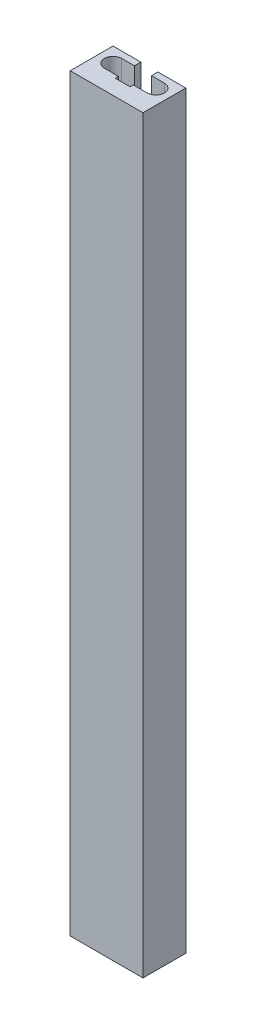
ISO-10303-21;
HEADER;
FILE_DESCRIPTION(('STEP AP214'),'2;1');
FILE_NAME('part.step','',(''),(''),'','','');
FILE_SCHEMA(('AUTOMOTIVE_DESIGN { 1 0 10303 214 1 1 1 1 }'));
ENDSEC;
DATA;
#1=APPLICATION_CONTEXT('core data for automotive mechanical design processes');
#2=APPLICATION_PROTOCOL_DEFINITION('international standard','automotive_design',2000,#1);
#3=PRODUCT_CONTEXT('',#1,'mechanical');
#4=PRODUCT('Part','Part','',(#3));
#5=PRODUCT_RELATED_PRODUCT_CATEGORY('part','',(#4));
#6=PRODUCT_DEFINITION_FORMATION('','',#4);
#7=PRODUCT_DEFINITION_CONTEXT('part definition',#1,'design');
#8=PRODUCT_DEFINITION('design','',#6,#7);
#9=PRODUCT_DEFINITION_SHAPE('','',#8);
#10=(LENGTH_UNIT() NAMED_UNIT(*) SI_UNIT(.MILLI.,.METRE.));
#11=(NAMED_UNIT(*) PLANE_ANGLE_UNIT() SI_UNIT($,.RADIAN.));
#12=(NAMED_UNIT(*) SI_UNIT($,.STERADIAN.) SOLID_ANGLE_UNIT());
#13=UNCERTAINTY_MEASURE_WITH_UNIT(LENGTH_MEASURE(1.E-05),#10,'distance_accuracy_value','');
#14=(GEOMETRIC_REPRESENTATION_CONTEXT(3) GLOBAL_UNCERTAINTY_ASSIGNED_CONTEXT((#13)) GLOBAL_UNIT_ASSIGNED_CONTEXT((#10,
#11,#12)) REPRESENTATION_CONTEXT('',''));
#15=CARTESIAN_POINT('',(0.,0.,0.));
#16=DIRECTION('',(0.,0.,1.));
#17=DIRECTION('',(1.,0.,0.));
#18=AXIS2_PLACEMENT_3D('',#15,#16,#17);
#19=CARTESIAN_POINT('',(17.,-175.,20.));
#20=DIRECTION('',(-1.,0.,0.));
#21=DIRECTION('',(0.,0.,1.));
#22=AXIS2_PLACEMENT_3D('',#19,#20,#21);
#23=PLANE('',#22);
#24=DIRECTION('',(0.,1.,0.));
#25=VECTOR('',#24,1.);
#26=CARTESIAN_POINT('',(17.,-175.,0.));
#27=LINE('',#26,#25);
#28=CARTESIAN_POINT('',(17.,-175.,0.));
#29=VERTEX_POINT('',#28);
#30=CARTESIAN_POINT('',(17.,175.,0.));
#31=VERTEX_POINT('',#30);
#32=EDGE_CURVE('E259',#29,#31,#27,.T.);
#33=ORIENTED_EDGE('',*,*,#32,.T.);
#34=DIRECTION('',(0.,0.,-1.));
#35=VECTOR('',#34,1.);
#36=CARTESIAN_POINT('',(17.,175.,20.));
#37=LINE('',#36,#35);
#38=CARTESIAN_POINT('',(17.,175.,20.));
#39=VERTEX_POINT('',#38);
#40=EDGE_CURVE('E12',#39,#31,#37,.T.);
#41=ORIENTED_EDGE('',*,*,#40,.F.);
#42=DIRECTION('',(0.,1.,0.));
#43=VECTOR('',#42,1.);
#44=CARTESIAN_POINT('',(17.,-175.,20.));
#45=LINE('',#44,#43);
#46=CARTESIAN_POINT('',(17.,-175.,20.));
#47=VERTEX_POINT('',#46);
#48=EDGE_CURVE('E261',#47,#39,#45,.T.);
#49=ORIENTED_EDGE('',*,*,#48,.F.);
#50=DIRECTION('',(0.,0.,-1.));
#51=VECTOR('',#50,1.);
#52=CARTESIAN_POINT('',(17.,-175.,20.));
#53=LINE('',#52,#51);
#54=EDGE_CURVE('E271',#47,#29,#53,.T.);
#55=ORIENTED_EDGE('',*,*,#54,.T.);
#56=EDGE_LOOP('',(#33,#41,#49,#55));
#57=FACE_BOUND('',#56,.T.);
#58=ADVANCED_FACE('F41',(#57),#23,.F.);
#59=CARTESIAN_POINT('',(-17.,175.,20.));
#60=DIRECTION('',(0.,-1.,0.));
#61=DIRECTION('',(0.,0.,-1.));
#62=AXIS2_PLACEMENT_3D('',#59,#60,#61);
#63=PLANE('',#62);
#64=DIRECTION('',(-1.,0.,0.));
#65=VECTOR('',#64,1.);
#66=CARTESIAN_POINT('',(-10.,175.,3.));
#67=LINE('',#66,#65);
#68=CARTESIAN_POINT('',(-4.,175.,3.));
#69=VERTEX_POINT('',#68);
#70=CARTESIAN_POINT('',(-10.,175.,3.));
#71=VERTEX_POINT('',#70);
#72=EDGE_CURVE('E176',#69,#71,#67,.T.);
#73=ORIENTED_EDGE('',*,*,#72,.F.);
#74=DIRECTION('',(0.,0.,1.));
#75=VECTOR('',#74,1.);
#76=CARTESIAN_POINT('',(-4.,175.,3.));
#77=LINE('',#76,#75);
#78=CARTESIAN_POINT('',(-4.,175.,0.));
#79=VERTEX_POINT('',#78);
#80=EDGE_CURVE('E220',#79,#69,#77,.T.);
#81=ORIENTED_EDGE('',*,*,#80,.F.);
#82=DIRECTION('',(-1.,0.,0.));
#83=VECTOR('',#82,1.);
#84=CARTESIAN_POINT('',(-17.,175.,0.));
#85=LINE('',#84,#83);
#86=CARTESIAN_POINT('',(-17.,175.,0.));
#87=VERTEX_POINT('',#86);
#88=EDGE_CURVE('E275',#79,#87,#85,.T.);
#89=ORIENTED_EDGE('',*,*,#88,.T.);
#90=DIRECTION('',(0.,0.,-1.));
#91=VECTOR('',#90,1.);
#92=CARTESIAN_POINT('',(-17.,175.,20.));
#93=LINE('',#92,#91);
#94=CARTESIAN_POINT('',(-17.,175.,20.));
#95=VERTEX_POINT('',#94);
#96=EDGE_CURVE('E49',#95,#87,#93,.T.);
#97=ORIENTED_EDGE('',*,*,#96,.F.);
#98=DIRECTION('',(-1.,0.,0.));
#99=VECTOR('',#98,1.);
#100=CARTESIAN_POINT('',(-17.,175.,20.));
#101=LINE('',#100,#99);
#102=EDGE_CURVE('E93',#39,#95,#101,.T.);
#103=ORIENTED_EDGE('',*,*,#102,.F.);
#104=ORIENTED_EDGE('',*,*,#40,.T.);
#105=CARTESIAN_POINT('',(4.,175.,0.));
#106=VERTEX_POINT('',#105);
#107=EDGE_CURVE('E276',#31,#106,#85,.T.);
#108=ORIENTED_EDGE('',*,*,#107,.T.);
#109=DIRECTION('',(0.,0.,-1.));
#110=VECTOR('',#109,1.);
#111=CARTESIAN_POINT('',(4.,175.,0.));
#112=LINE('',#111,#110);
#113=CARTESIAN_POINT('',(4.,175.,3.));
#114=VERTEX_POINT('',#113);
#115=EDGE_CURVE('E217',#114,#106,#112,.T.);
#116=ORIENTED_EDGE('',*,*,#115,.F.);
#117=DIRECTION('',(-1.,0.,0.));
#118=VECTOR('',#117,1.);
#119=CARTESIAN_POINT('',(4.,175.,3.));
#120=LINE('',#119,#118);
#121=CARTESIAN_POINT('',(10.,175.,3.));
#122=VERTEX_POINT('',#121);
#123=EDGE_CURVE('E213',#122,#114,#120,.T.);
#124=ORIENTED_EDGE('',*,*,#123,.F.);
#125=CARTESIAN_POINT('',(10.,175.,7.));
#126=DIRECTION('',(0.,1.,0.));
#127=DIRECTION('',(0.,0.,-1.));
#128=AXIS2_PLACEMENT_3D('',#125,#126,#127);
#129=CIRCLE('',#128,4.);
#130=CARTESIAN_POINT('',(10.,175.,11.));
#131=VERTEX_POINT('',#130);
#132=EDGE_CURVE('E209',#131,#122,#129,.T.);
#133=ORIENTED_EDGE('',*,*,#132,.F.);
#134=DIRECTION('',(1.,0.,0.));
#135=VECTOR('',#134,1.);
#136=CARTESIAN_POINT('',(10.,175.,11.));
#137=LINE('',#136,#135);
#138=CARTESIAN_POINT('',(3.5,175.,11.));
#139=VERTEX_POINT('',#138);
#140=EDGE_CURVE('E205',#139,#131,#137,.T.);
#141=ORIENTED_EDGE('',*,*,#140,.F.);
#142=DIRECTION('',(0.,0.,-1.));
#143=VECTOR('',#142,1.);
#144=CARTESIAN_POINT('',(3.5,175.,12.5));
#145=LINE('',#144,#143);
#146=CARTESIAN_POINT('',(3.5,175.,12.5));
#147=VERTEX_POINT('',#146);
#148=EDGE_CURVE('E201',#147,#139,#145,.T.);
#149=ORIENTED_EDGE('',*,*,#148,.F.);
#150=DIRECTION('',(1.,0.,0.));
#151=VECTOR('',#150,1.);
#152=CARTESIAN_POINT('',(-3.5,175.,12.5));
#153=LINE('',#152,#151);
#154=CARTESIAN_POINT('',(-3.5,175.,12.5));
#155=VERTEX_POINT('',#154);
#156=EDGE_CURVE('E194',#155,#147,#153,.T.);
#157=ORIENTED_EDGE('',*,*,#156,.F.);
#158=DIRECTION('',(0.,0.,1.));
#159=VECTOR('',#158,1.);
#160=CARTESIAN_POINT('',(-3.5,175.,11.));
#161=LINE('',#160,#159);
#162=CARTESIAN_POINT('',(-3.5,175.,11.));
#163=VERTEX_POINT('',#162);
#164=EDGE_CURVE('E190',#163,#155,#161,.T.);
#165=ORIENTED_EDGE('',*,*,#164,.F.);
#166=DIRECTION('',(1.,0.,0.));
#167=VECTOR('',#166,1.);
#168=CARTESIAN_POINT('',(-3.5,175.,11.));
#169=LINE('',#168,#167);
#170=CARTESIAN_POINT('',(-10.,175.,11.));
#171=VERTEX_POINT('',#170);
#172=EDGE_CURVE('E168',#171,#163,#169,.T.);
#173=ORIENTED_EDGE('',*,*,#172,.F.);
#174=CARTESIAN_POINT('',(-10.,175.,7.));
#175=DIRECTION('',(0.,1.,0.));
#176=DIRECTION('',(0.,0.,-1.));
#177=AXIS2_PLACEMENT_3D('',#174,#175,#176);
#178=CIRCLE('',#177,4.);
#179=EDGE_CURVE('E179',#71,#171,#178,.T.);
#180=ORIENTED_EDGE('',*,*,#179,.F.);
#181=EDGE_LOOP('',(#73,#81,#89,#97,#103,#104,#108,#116,#124,#133,#141,#149,#157,#165,#173,#180));
#182=FACE_BOUND('',#181,.T.);
#183=ADVANCED_FACE('F187',(#182),#63,.F.);
#184=CARTESIAN_POINT('',(-17.,-175.,20.));
#185=DIRECTION('',(1.,0.,0.));
#186=DIRECTION('',(0.,0.,-1.));
#187=AXIS2_PLACEMENT_3D('',#184,#185,#186);
#188=PLANE('',#187);
#189=DIRECTION('',(0.,-1.,0.));
#190=VECTOR('',#189,1.);
#191=CARTESIAN_POINT('',(-17.,-175.,0.));
#192=LINE('',#191,#190);
#193=CARTESIAN_POINT('',(-17.,-175.,0.));
#194=VERTEX_POINT('',#193);
#195=EDGE_CURVE('E280',#87,#194,#192,.T.);
#196=ORIENTED_EDGE('',*,*,#195,.T.);
#197=DIRECTION('',(0.,0.,-1.));
#198=VECTOR('',#197,1.);
#199=CARTESIAN_POINT('',(-17.,-175.,20.));
#200=LINE('',#199,#198);
#201=CARTESIAN_POINT('',(-17.,-175.,20.));
#202=VERTEX_POINT('',#201);
#203=EDGE_CURVE('E287',#202,#194,#200,.T.);
#204=ORIENTED_EDGE('',*,*,#203,.F.);
#205=DIRECTION('',(0.,-1.,0.));
#206=VECTOR('',#205,1.);
#207=CARTESIAN_POINT('',(-17.,-175.,20.));
#208=LINE('',#207,#206);
#209=EDGE_CURVE('E266',#95,#202,#208,.T.);
#210=ORIENTED_EDGE('',*,*,#209,.F.);
#211=ORIENTED_EDGE('',*,*,#96,.T.);
#212=EDGE_LOOP('',(#196,#204,#210,#211));
#213=FACE_BOUND('',#212,.T.);
#214=ADVANCED_FACE('F294',(#213),#188,.F.);
#215=CARTESIAN_POINT('',(-17.,-175.,20.));
#216=DIRECTION('',(0.,1.,0.));
#217=DIRECTION('',(0.,0.,1.));
#218=AXIS2_PLACEMENT_3D('',#215,#216,#217);
#219=PLANE('',#218);
#220=DIRECTION('',(1.,0.,0.));
#221=VECTOR('',#220,1.);
#222=CARTESIAN_POINT('',(-17.,-175.,0.));
#223=LINE('',#222,#221);
#224=EDGE_CURVE('E86',#194,#29,#223,.T.);
#225=ORIENTED_EDGE('',*,*,#224,.T.);
#226=ORIENTED_EDGE('',*,*,#54,.F.);
#227=DIRECTION('',(1.,0.,0.));
#228=VECTOR('',#227,1.);
#229=CARTESIAN_POINT('',(-17.,-175.,20.));
#230=LINE('',#229,#228);
#231=EDGE_CURVE('E65',#202,#47,#230,.T.);
#232=ORIENTED_EDGE('',*,*,#231,.F.);
#233=ORIENTED_EDGE('',*,*,#203,.T.);
#234=EDGE_LOOP('',(#225,#226,#232,#233));
#235=FACE_BOUND('',#234,.T.);
#236=ADVANCED_FACE('F304',(#235),#219,.F.);
#237=CARTESIAN_POINT('',(0.,0.,20.));
#238=DIRECTION('',(0.,0.,-1.));
#239=DIRECTION('',(-1.,0.,0.));
#240=AXIS2_PLACEMENT_3D('',#237,#238,#239);
#241=PLANE('',#240);
#242=ORIENTED_EDGE('',*,*,#48,.T.);
#243=ORIENTED_EDGE('',*,*,#102,.T.);
#244=ORIENTED_EDGE('',*,*,#209,.T.);
#245=ORIENTED_EDGE('',*,*,#231,.T.);
#246=EDGE_LOOP('',(#242,#243,#244,#245));
#247=FACE_BOUND('',#246,.T.);
#248=ADVANCED_FACE('F306',(#247),#241,.F.);
#249=CARTESIAN_POINT('',(0.,0.,0.));
#250=DIRECTION('',(0.,0.,-1.));
#251=DIRECTION('',(-1.,0.,0.));
#252=AXIS2_PLACEMENT_3D('',#249,#250,#251);
#253=PLANE('',#252);
#254=DIRECTION('',(0.,1.,0.));
#255=VECTOR('',#254,1.);
#256=CARTESIAN_POINT('',(-4.,-205.663496212924,0.));
#257=LINE('',#256,#255);
#258=CARTESIAN_POINT('',(-4.,-155.,0.));
#259=VERTEX_POINT('',#258);
#260=EDGE_CURVE('E232',#259,#79,#257,.T.);
#261=ORIENTED_EDGE('',*,*,#260,.F.);
#262=DIRECTION('',(1.,0.,0.));
#263=VECTOR('',#262,1.);
#264=CARTESIAN_POINT('',(-4.,-155.,0.));
#265=LINE('',#264,#263);
#266=CARTESIAN_POINT('',(4.,-155.,0.));
#267=VERTEX_POINT('',#266);
#268=EDGE_CURVE('E474',#259,#267,#265,.T.);
#269=ORIENTED_EDGE('',*,*,#268,.T.);
#270=DIRECTION('',(0.,1.,0.));
#271=VECTOR('',#270,1.);
#272=CARTESIAN_POINT('',(4.,-205.663496212924,0.));
#273=LINE('',#272,#271);
#274=EDGE_CURVE('E56',#267,#106,#273,.T.);
#275=ORIENTED_EDGE('',*,*,#274,.T.);
#276=ORIENTED_EDGE('',*,*,#107,.F.);
#277=ORIENTED_EDGE('',*,*,#32,.F.);
#278=ORIENTED_EDGE('',*,*,#224,.F.);
#279=ORIENTED_EDGE('',*,*,#195,.F.);
#280=ORIENTED_EDGE('',*,*,#88,.F.);
#281=EDGE_LOOP('',(#261,#269,#275,#276,#277,#278,#279,#280));
#282=FACE_BOUND('',#281,.T.);
#283=ADVANCED_FACE('F299',(#282),#253,.T.);
#284=CARTESIAN_POINT('',(-10.,-205.663496212924,7.));
#285=DIRECTION('',(0.,1.,0.));
#286=DIRECTION('',(0.,0.,1.));
#287=AXIS2_PLACEMENT_3D('',#284,#285,#286);
#288=CYLINDRICAL_SURFACE('',#287,4.);
#289=CARTESIAN_POINT('',(-10.,-155.,7.));
#290=DIRECTION('',(0.,1.,0.));
#291=DIRECTION('',(0.,0.,1.));
#292=AXIS2_PLACEMENT_3D('',#289,#290,#291);
#293=CIRCLE('',#292,4.);
#294=CARTESIAN_POINT('',(-10.,-155.,11.));
#295=VERTEX_POINT('',#294);
#296=CARTESIAN_POINT('',(-10.,-155.,3.));
#297=VERTEX_POINT('',#296);
#298=EDGE_CURVE('E260',#295,#297,#293,.F.);
#299=ORIENTED_EDGE('',*,*,#298,.T.);
#300=DIRECTION('',(0.,1.,0.));
#301=VECTOR('',#300,1.);
#302=CARTESIAN_POINT('',(-10.,-205.663496212924,3.));
#303=LINE('',#302,#301);
#304=EDGE_CURVE('E182',#297,#71,#303,.T.);
#305=ORIENTED_EDGE('',*,*,#304,.T.);
#306=ORIENTED_EDGE('',*,*,#179,.T.);
#307=DIRECTION('',(0.,1.,0.));
#308=VECTOR('',#307,1.);
#309=CARTESIAN_POINT('',(-10.,-205.663496212924,11.));
#310=LINE('',#309,#308);
#311=EDGE_CURVE('E163',#295,#171,#310,.T.);
#312=ORIENTED_EDGE('',*,*,#311,.F.);
#313=EDGE_LOOP('',(#299,#305,#306,#312));
#314=FACE_BOUND('',#313,.T.);
#315=ADVANCED_FACE('F180',(#314),#288,.F.);
#316=CARTESIAN_POINT('',(-10.,-205.663496212924,3.));
#317=DIRECTION('',(0.,0.,-1.));
#318=DIRECTION('',(-1.,0.,0.));
#319=AXIS2_PLACEMENT_3D('',#316,#317,#318);
#320=PLANE('',#319);
#321=DIRECTION('',(1.,0.,0.));
#322=VECTOR('',#321,1.);
#323=CARTESIAN_POINT('',(-10.,-155.,3.));
#324=LINE('',#323,#322);
#325=CARTESIAN_POINT('',(-4.,-155.,3.));
#326=VERTEX_POINT('',#325);
#327=EDGE_CURVE('E466',#297,#326,#324,.T.);
#328=ORIENTED_EDGE('',*,*,#327,.T.);
#329=DIRECTION('',(0.,1.,0.));
#330=VECTOR('',#329,1.);
#331=CARTESIAN_POINT('',(-4.,-205.663496212924,3.));
#332=LINE('',#331,#330);
#333=EDGE_CURVE('E229',#326,#69,#332,.T.);
#334=ORIENTED_EDGE('',*,*,#333,.T.);
#335=ORIENTED_EDGE('',*,*,#72,.T.);
#336=ORIENTED_EDGE('',*,*,#304,.F.);
#337=EDGE_LOOP('',(#328,#334,#335,#336));
#338=FACE_BOUND('',#337,.T.);
#339=ADVANCED_FACE('F350',(#338),#320,.F.);
#340=CARTESIAN_POINT('',(-4.,-205.663496212924,3.));
#341=DIRECTION('',(-1.,0.,0.));
#342=DIRECTION('',(0.,0.,1.));
#343=AXIS2_PLACEMENT_3D('',#340,#341,#342);
#344=PLANE('',#343);
#345=DIRECTION('',(0.,0.,-1.));
#346=VECTOR('',#345,1.);
#347=CARTESIAN_POINT('',(-4.,-155.,3.));
#348=LINE('',#347,#346);
#349=EDGE_CURVE('E469',#326,#259,#348,.T.);
#350=ORIENTED_EDGE('',*,*,#349,.T.);
#351=ORIENTED_EDGE('',*,*,#260,.T.);
#352=ORIENTED_EDGE('',*,*,#80,.T.);
#353=ORIENTED_EDGE('',*,*,#333,.F.);
#354=EDGE_LOOP('',(#350,#351,#352,#353));
#355=FACE_BOUND('',#354,.T.);
#356=ADVANCED_FACE('F357',(#355),#344,.F.);
#357=CARTESIAN_POINT('',(4.,-205.663496212924,0.));
#358=DIRECTION('',(1.,0.,0.));
#359=DIRECTION('',(0.,0.,-1.));
#360=AXIS2_PLACEMENT_3D('',#357,#358,#359);
#361=PLANE('',#360);
#362=DIRECTION('',(0.,0.,1.));
#363=VECTOR('',#362,1.);
#364=CARTESIAN_POINT('',(4.,-155.,0.));
#365=LINE('',#364,#363);
#366=CARTESIAN_POINT('',(4.,-155.,3.));
#367=VERTEX_POINT('',#366);
#368=EDGE_CURVE('E478',#267,#367,#365,.T.);
#369=ORIENTED_EDGE('',*,*,#368,.T.);
#370=DIRECTION('',(0.,1.,0.));
#371=VECTOR('',#370,1.);
#372=CARTESIAN_POINT('',(4.,-205.663496212924,3.));
#373=LINE('',#372,#371);
#374=EDGE_CURVE('E237',#367,#114,#373,.T.);
#375=ORIENTED_EDGE('',*,*,#374,.T.);
#376=ORIENTED_EDGE('',*,*,#115,.T.);
#377=ORIENTED_EDGE('',*,*,#274,.F.);
#378=EDGE_LOOP('',(#369,#375,#376,#377));
#379=FACE_BOUND('',#378,.T.);
#380=ADVANCED_FACE('F365',(#379),#361,.F.);
#381=CARTESIAN_POINT('',(4.,-205.663496212924,3.));
#382=DIRECTION('',(0.,0.,-1.));
#383=DIRECTION('',(-1.,0.,0.));
#384=AXIS2_PLACEMENT_3D('',#381,#382,#383);
#385=PLANE('',#384);
#386=DIRECTION('',(1.,0.,0.));
#387=VECTOR('',#386,1.);
#388=CARTESIAN_POINT('',(4.,-155.,3.));
#389=LINE('',#388,#387);
#390=CARTESIAN_POINT('',(10.,-155.,3.));
#391=VERTEX_POINT('',#390);
#392=EDGE_CURVE('E481',#367,#391,#389,.T.);
#393=ORIENTED_EDGE('',*,*,#392,.T.);
#394=DIRECTION('',(0.,1.,0.));
#395=VECTOR('',#394,1.);
#396=CARTESIAN_POINT('',(10.,-205.663496212924,3.));
#397=LINE('',#396,#395);
#398=EDGE_CURVE('E240',#391,#122,#397,.T.);
#399=ORIENTED_EDGE('',*,*,#398,.T.);
#400=ORIENTED_EDGE('',*,*,#123,.T.);
#401=ORIENTED_EDGE('',*,*,#374,.F.);
#402=EDGE_LOOP('',(#393,#399,#400,#401));
#403=FACE_BOUND('',#402,.T.);
#404=ADVANCED_FACE('F373',(#403),#385,.F.);
#405=CARTESIAN_POINT('',(10.,-205.663496212924,7.));
#406=DIRECTION('',(0.,1.,0.));
#407=DIRECTION('',(0.,0.,1.));
#408=AXIS2_PLACEMENT_3D('',#405,#406,#407);
#409=CYLINDRICAL_SURFACE('',#408,4.);
#410=CARTESIAN_POINT('',(10.,-155.,7.));
#411=DIRECTION('',(0.,1.,0.));
#412=DIRECTION('',(0.,0.,1.));
#413=AXIS2_PLACEMENT_3D('',#410,#411,#412);
#414=CIRCLE('',#413,4.);
#415=CARTESIAN_POINT('',(10.,-155.,11.));
#416=VERTEX_POINT('',#415);
#417=EDGE_CURVE('E484',#391,#416,#414,.F.);
#418=ORIENTED_EDGE('',*,*,#417,.T.);
#419=DIRECTION('',(0.,1.,0.));
#420=VECTOR('',#419,1.);
#421=CARTESIAN_POINT('',(10.,-205.663496212924,11.));
#422=LINE('',#421,#420);
#423=EDGE_CURVE('E243',#416,#131,#422,.T.);
#424=ORIENTED_EDGE('',*,*,#423,.T.);
#425=ORIENTED_EDGE('',*,*,#132,.T.);
#426=ORIENTED_EDGE('',*,*,#398,.F.);
#427=EDGE_LOOP('',(#418,#424,#425,#426));
#428=FACE_BOUND('',#427,.T.);
#429=ADVANCED_FACE('F380',(#428),#409,.F.);
#430=CARTESIAN_POINT('',(10.,-205.663496212924,11.));
#431=DIRECTION('',(0.,0.,1.));
#432=DIRECTION('',(1.,0.,0.));
#433=AXIS2_PLACEMENT_3D('',#430,#431,#432);
#434=PLANE('',#433);
#435=DIRECTION('',(-1.,0.,0.));
#436=VECTOR('',#435,1.);
#437=CARTESIAN_POINT('',(10.,-155.,11.));
#438=LINE('',#437,#436);
#439=CARTESIAN_POINT('',(3.5,-155.,11.));
#440=VERTEX_POINT('',#439);
#441=EDGE_CURVE('E487',#416,#440,#438,.T.);
#442=ORIENTED_EDGE('',*,*,#441,.T.);
#443=DIRECTION('',(0.,1.,0.));
#444=VECTOR('',#443,1.);
#445=CARTESIAN_POINT('',(3.5,-205.663496212924,11.));
#446=LINE('',#445,#444);
#447=EDGE_CURVE('E246',#440,#139,#446,.T.);
#448=ORIENTED_EDGE('',*,*,#447,.T.);
#449=ORIENTED_EDGE('',*,*,#140,.T.);
#450=ORIENTED_EDGE('',*,*,#423,.F.);
#451=EDGE_LOOP('',(#442,#448,#449,#450));
#452=FACE_BOUND('',#451,.T.);
#453=ADVANCED_FACE('F388',(#452),#434,.F.);
#454=CARTESIAN_POINT('',(3.5,-205.663496212924,12.5));
#455=DIRECTION('',(1.,0.,0.));
#456=DIRECTION('',(0.,0.,-1.));
#457=AXIS2_PLACEMENT_3D('',#454,#455,#456);
#458=PLANE('',#457);
#459=DIRECTION('',(0.,0.,1.));
#460=VECTOR('',#459,1.);
#461=CARTESIAN_POINT('',(3.5,-155.,12.5));
#462=LINE('',#461,#460);
#463=CARTESIAN_POINT('',(3.5,-155.,12.5));
#464=VERTEX_POINT('',#463);
#465=EDGE_CURVE('E490',#440,#464,#462,.T.);
#466=ORIENTED_EDGE('',*,*,#465,.T.);
#467=DIRECTION('',(0.,1.,0.));
#468=VECTOR('',#467,1.);
#469=CARTESIAN_POINT('',(3.5,-205.663496212924,12.5));
#470=LINE('',#469,#468);
#471=EDGE_CURVE('E249',#464,#147,#470,.T.);
#472=ORIENTED_EDGE('',*,*,#471,.T.);
#473=ORIENTED_EDGE('',*,*,#148,.T.);
#474=ORIENTED_EDGE('',*,*,#447,.F.);
#475=EDGE_LOOP('',(#466,#472,#473,#474));
#476=FACE_BOUND('',#475,.T.);
#477=ADVANCED_FACE('F396',(#476),#458,.F.);
#478=CARTESIAN_POINT('',(-3.5,-205.663496212924,12.5));
#479=DIRECTION('',(0.,0.,1.));
#480=DIRECTION('',(1.,0.,0.));
#481=AXIS2_PLACEMENT_3D('',#478,#479,#480);
#482=PLANE('',#481);
#483=DIRECTION('',(-1.,0.,0.));
#484=VECTOR('',#483,1.);
#485=CARTESIAN_POINT('',(-3.5,-155.,12.5));
#486=LINE('',#485,#484);
#487=CARTESIAN_POINT('',(-3.5,-155.,12.5));
#488=VERTEX_POINT('',#487);
#489=EDGE_CURVE('E493',#464,#488,#486,.T.);
#490=ORIENTED_EDGE('',*,*,#489,.T.);
#491=DIRECTION('',(0.,1.,0.));
#492=VECTOR('',#491,1.);
#493=CARTESIAN_POINT('',(-3.5,-205.663496212924,12.5));
#494=LINE('',#493,#492);
#495=EDGE_CURVE('E252',#488,#155,#494,.T.);
#496=ORIENTED_EDGE('',*,*,#495,.T.);
#497=ORIENTED_EDGE('',*,*,#156,.T.);
#498=ORIENTED_EDGE('',*,*,#471,.F.);
#499=EDGE_LOOP('',(#490,#496,#497,#498));
#500=FACE_BOUND('',#499,.T.);
#501=ADVANCED_FACE('F404',(#500),#482,.F.);
#502=CARTESIAN_POINT('',(-3.5,-205.663496212924,11.));
#503=DIRECTION('',(-1.,0.,0.));
#504=DIRECTION('',(0.,0.,1.));
#505=AXIS2_PLACEMENT_3D('',#502,#503,#504);
#506=PLANE('',#505);
#507=DIRECTION('',(0.,0.,-1.));
#508=VECTOR('',#507,1.);
#509=CARTESIAN_POINT('',(-3.5,-155.,11.));
#510=LINE('',#509,#508);
#511=CARTESIAN_POINT('',(-3.5,-155.,11.));
#512=VERTEX_POINT('',#511);
#513=EDGE_CURVE('E228',#488,#512,#510,.T.);
#514=ORIENTED_EDGE('',*,*,#513,.T.);
#515=DIRECTION('',(0.,1.,0.));
#516=VECTOR('',#515,1.);
#517=CARTESIAN_POINT('',(-3.5,-205.663496212924,11.));
#518=LINE('',#517,#516);
#519=EDGE_CURVE('E175',#512,#163,#518,.T.);
#520=ORIENTED_EDGE('',*,*,#519,.T.);
#521=ORIENTED_EDGE('',*,*,#164,.T.);
#522=ORIENTED_EDGE('',*,*,#495,.F.);
#523=EDGE_LOOP('',(#514,#520,#521,#522));
#524=FACE_BOUND('',#523,.T.);
#525=ADVANCED_FACE('F412',(#524),#506,.F.);
#526=CARTESIAN_POINT('',(-3.5,-205.663496212924,11.));
#527=DIRECTION('',(0.,0.,1.));
#528=DIRECTION('',(1.,0.,0.));
#529=AXIS2_PLACEMENT_3D('',#526,#527,#528);
#530=PLANE('',#529);
#531=DIRECTION('',(-1.,0.,0.));
#532=VECTOR('',#531,1.);
#533=CARTESIAN_POINT('',(-3.5,-155.,11.));
#534=LINE('',#533,#532);
#535=EDGE_CURVE('E171',#512,#295,#534,.T.);
#536=ORIENTED_EDGE('',*,*,#535,.T.);
#537=ORIENTED_EDGE('',*,*,#311,.T.);
#538=ORIENTED_EDGE('',*,*,#172,.T.);
#539=ORIENTED_EDGE('',*,*,#519,.F.);
#540=EDGE_LOOP('',(#536,#537,#538,#539));
#541=FACE_BOUND('',#540,.T.);
#542=ADVANCED_FACE('F165',(#541),#530,.F.);
#543=CARTESIAN_POINT('',(-17.,-155.,20.));
#544=DIRECTION('',(0.,1.,0.));
#545=DIRECTION('',(0.,0.,1.));
#546=AXIS2_PLACEMENT_3D('',#543,#544,#545);
#547=PLANE('',#546);
#548=ORIENTED_EDGE('',*,*,#298,.F.);
#549=ORIENTED_EDGE('',*,*,#535,.F.);
#550=ORIENTED_EDGE('',*,*,#513,.F.);
#551=ORIENTED_EDGE('',*,*,#489,.F.);
#552=ORIENTED_EDGE('',*,*,#465,.F.);
#553=ORIENTED_EDGE('',*,*,#441,.F.);
#554=ORIENTED_EDGE('',*,*,#417,.F.);
#555=ORIENTED_EDGE('',*,*,#392,.F.);
#556=ORIENTED_EDGE('',*,*,#368,.F.);
#557=ORIENTED_EDGE('',*,*,#268,.F.);
#558=ORIENTED_EDGE('',*,*,#349,.F.);
#559=ORIENTED_EDGE('',*,*,#327,.F.);
#560=EDGE_LOOP('',(#548,#549,#550,#551,#552,#553,#554,#555,#556,#557,#558,#559));
#561=FACE_BOUND('',#560,.T.);
#562=ADVANCED_FACE('F427',(#561),#547,.T.);
#563=CLOSED_SHELL('',(#58,#183,#214,#236,#248,#283,#315,#339,#356,#380,#404,#429,#453,#477,#501,
#525,#542,#562));
#564=MANIFOLD_SOLID_BREP('B2',#563);
#565=ADVANCED_BREP_SHAPE_REPRESENTATION('',(#18,#564),#14);
#566=SHAPE_DEFINITION_REPRESENTATION(#9,#565);
ENDSEC;
END-ISO-10303-21;
